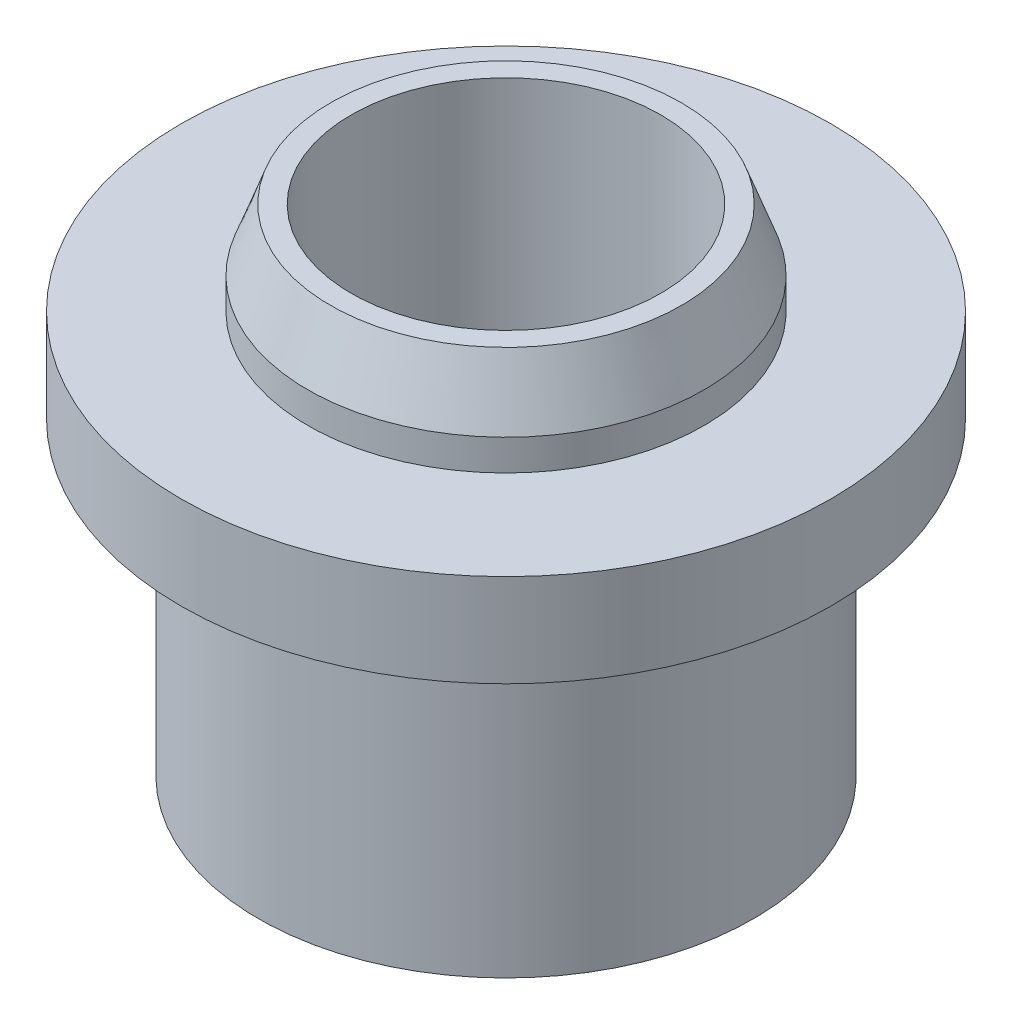
ISO-10303-21;
HEADER;
FILE_DESCRIPTION(('STEP AP214'),'2;1');
FILE_NAME('part.step','',(''),(''),'','','');
FILE_SCHEMA(('AUTOMOTIVE_DESIGN { 1 0 10303 214 1 1 1 1 }'));
ENDSEC;
DATA;
#1=APPLICATION_CONTEXT('core data for automotive mechanical design processes');
#2=APPLICATION_PROTOCOL_DEFINITION('international standard','automotive_design',2000,#1);
#3=PRODUCT_CONTEXT('',#1,'mechanical');
#4=PRODUCT('Part','Part','',(#3));
#5=PRODUCT_RELATED_PRODUCT_CATEGORY('part','',(#4));
#6=PRODUCT_DEFINITION_FORMATION('','',#4);
#7=PRODUCT_DEFINITION_CONTEXT('part definition',#1,'design');
#8=PRODUCT_DEFINITION('design','',#6,#7);
#9=PRODUCT_DEFINITION_SHAPE('','',#8);
#10=(LENGTH_UNIT() NAMED_UNIT(*) SI_UNIT(.MILLI.,.METRE.));
#11=(NAMED_UNIT(*) PLANE_ANGLE_UNIT() SI_UNIT($,.RADIAN.));
#12=(NAMED_UNIT(*) SI_UNIT($,.STERADIAN.) SOLID_ANGLE_UNIT());
#13=UNCERTAINTY_MEASURE_WITH_UNIT(LENGTH_MEASURE(1.E-05),#10,'distance_accuracy_value','');
#14=(GEOMETRIC_REPRESENTATION_CONTEXT(3) GLOBAL_UNCERTAINTY_ASSIGNED_CONTEXT((#13)) GLOBAL_UNIT_ASSIGNED_CONTEXT((#10,
#11,#12)) REPRESENTATION_CONTEXT('',''));
#15=CARTESIAN_POINT('',(0.,0.,0.));
#16=DIRECTION('',(0.,0.,1.));
#17=DIRECTION('',(1.,0.,0.));
#18=AXIS2_PLACEMENT_3D('',#15,#16,#17);
#19=CARTESIAN_POINT('',(4.,-0.0762641792075451,0.));
#20=DIRECTION('',(0.,-1.,0.));
#21=DIRECTION('',(0.,0.,-1.));
#22=AXIS2_PLACEMENT_3D('',#19,#20,#21);
#23=PLANE('',#22);
#24=CARTESIAN_POINT('',(0.,-0.076264179207545,0.));
#25=DIRECTION('',(0.,-1.,0.));
#26=DIRECTION('',(0.,0.,-1.));
#27=AXIS2_PLACEMENT_3D('',#24,#25,#26);
#28=CIRCLE('',#27,4.);
#29=CARTESIAN_POINT('',(0.,-0.076264179207545,-4.));
#30=VERTEX_POINT('',#29);
#31=EDGE_CURVE('E64',#30,#30,#28,.T.);
#32=ORIENTED_EDGE('',*,*,#31,.T.);
#33=EDGE_LOOP('',(#32));
#34=FACE_BOUND('',#33,.T.);
#35=CARTESIAN_POINT('',(0.,-0.0762641792075452,0.));
#36=DIRECTION('',(0.,-1.,0.));
#37=DIRECTION('',(0.,0.,-1.));
#38=AXIS2_PLACEMENT_3D('',#35,#36,#37);
#39=CIRCLE('',#38,2.5);
#40=CARTESIAN_POINT('',(0.,-0.0762641792075452,-2.5));
#41=VERTEX_POINT('',#40);
#42=EDGE_CURVE('E10',#41,#41,#39,.T.);
#43=ORIENTED_EDGE('',*,*,#42,.F.);
#44=EDGE_LOOP('',(#43));
#45=FACE_BOUND('',#44,.T.);
#46=ADVANCED_FACE('F33',(#34,#45),#23,.T.);
#47=CARTESIAN_POINT('',(0.,0.,0.));
#48=DIRECTION('',(0.,-1.,0.));
#49=DIRECTION('',(0.,0.,-1.));
#50=AXIS2_PLACEMENT_3D('',#47,#48,#49);
#51=CYLINDRICAL_SURFACE('',#50,2.5);
#52=ORIENTED_EDGE('',*,*,#42,.T.);
#53=EDGE_LOOP('',(#52));
#54=FACE_BOUND('',#53,.T.);
#55=CARTESIAN_POINT('',(0.,7.92373582079246,0.));
#56=DIRECTION('',(0.,-1.,0.));
#57=DIRECTION('',(0.,0.,-1.));
#58=AXIS2_PLACEMENT_3D('',#55,#56,#57);
#59=CIRCLE('',#58,2.5);
#60=CARTESIAN_POINT('',(0.,7.92373582079246,-2.5));
#61=VERTEX_POINT('',#60);
#62=EDGE_CURVE('E39',#61,#61,#59,.T.);
#63=ORIENTED_EDGE('',*,*,#62,.F.);
#64=EDGE_LOOP('',(#63));
#65=FACE_BOUND('',#64,.T.);
#66=ADVANCED_FACE('F82',(#54,#65),#51,.F.);
#67=CARTESIAN_POINT('',(2.5,7.92373582079246,0.));
#68=DIRECTION('',(0.,1.,0.));
#69=DIRECTION('',(0.,0.,1.));
#70=AXIS2_PLACEMENT_3D('',#67,#68,#69);
#71=PLANE('',#70);
#72=ORIENTED_EDGE('',*,*,#62,.T.);
#73=EDGE_LOOP('',(#72));
#74=FACE_BOUND('',#73,.T.);
#75=CARTESIAN_POINT('',(0.,7.92373582079246,0.));
#76=DIRECTION('',(0.,-1.,0.));
#77=DIRECTION('',(0.,0.,-1.));
#78=AXIS2_PLACEMENT_3D('',#75,#76,#77);
#79=CIRCLE('',#78,2.8360297657338);
#80=CARTESIAN_POINT('',(0.,7.92373582079246,-2.8360297657338));
#81=VERTEX_POINT('',#80);
#82=EDGE_CURVE('E43',#81,#81,#79,.T.);
#83=ORIENTED_EDGE('',*,*,#82,.F.);
#84=EDGE_LOOP('',(#83));
#85=FACE_BOUND('',#84,.T.);
#86=ADVANCED_FACE('F86',(#74,#85),#71,.T.);
#87=CARTESIAN_POINT('',(0.,6.92373582079246,0.));
#88=DIRECTION('',(0.,-1.,0.));
#89=DIRECTION('',(0.,0.,-1.));
#90=AXIS2_PLACEMENT_3D('',#87,#88,#89);
#91=CONICAL_SURFACE('',#90,3.2,0.349065850398863);
#92=ORIENTED_EDGE('',*,*,#82,.T.);
#93=EDGE_LOOP('',(#92));
#94=FACE_BOUND('',#93,.T.);
#95=CARTESIAN_POINT('',(0.,6.92373582079246,0.));
#96=DIRECTION('',(0.,-1.,0.));
#97=DIRECTION('',(0.,0.,-1.));
#98=AXIS2_PLACEMENT_3D('',#95,#96,#97);
#99=CIRCLE('',#98,3.2);
#100=CARTESIAN_POINT('',(0.,6.92373582079246,-3.2));
#101=VERTEX_POINT('',#100);
#102=EDGE_CURVE('E47',#101,#101,#99,.T.);
#103=ORIENTED_EDGE('',*,*,#102,.F.);
#104=EDGE_LOOP('',(#103));
#105=FACE_BOUND('',#104,.T.);
#106=ADVANCED_FACE('F90',(#94,#105),#91,.T.);
#107=CARTESIAN_POINT('',(0.,0.,0.));
#108=DIRECTION('',(0.,-1.,0.));
#109=DIRECTION('',(0.,0.,-1.));
#110=AXIS2_PLACEMENT_3D('',#107,#108,#109);
#111=CYLINDRICAL_SURFACE('',#110,3.2);
#112=ORIENTED_EDGE('',*,*,#102,.T.);
#113=EDGE_LOOP('',(#112));
#114=FACE_BOUND('',#113,.T.);
#115=CARTESIAN_POINT('',(0.,6.42373582079246,0.));
#116=DIRECTION('',(0.,-1.,0.));
#117=DIRECTION('',(0.,0.,-1.));
#118=AXIS2_PLACEMENT_3D('',#115,#116,#117);
#119=CIRCLE('',#118,3.2);
#120=CARTESIAN_POINT('',(0.,6.42373582079246,-3.2));
#121=VERTEX_POINT('',#120);
#122=EDGE_CURVE('E52',#121,#121,#119,.T.);
#123=ORIENTED_EDGE('',*,*,#122,.F.);
#124=EDGE_LOOP('',(#123));
#125=FACE_BOUND('',#124,.T.);
#126=ADVANCED_FACE('F96',(#114,#125),#111,.T.);
#127=CARTESIAN_POINT('',(3.2,6.42373582079246,0.));
#128=DIRECTION('',(0.,1.,0.));
#129=DIRECTION('',(0.,0.,1.));
#130=AXIS2_PLACEMENT_3D('',#127,#128,#129);
#131=PLANE('',#130);
#132=ORIENTED_EDGE('',*,*,#122,.T.);
#133=EDGE_LOOP('',(#132));
#134=FACE_BOUND('',#133,.T.);
#135=CARTESIAN_POINT('',(0.,6.42373582079246,0.));
#136=DIRECTION('',(0.,-1.,0.));
#137=DIRECTION('',(0.,0.,-1.));
#138=AXIS2_PLACEMENT_3D('',#135,#136,#137);
#139=CIRCLE('',#138,5.25);
#140=CARTESIAN_POINT('',(0.,6.42373582079246,-5.25));
#141=VERTEX_POINT('',#140);
#142=EDGE_CURVE('E55',#141,#141,#139,.T.);
#143=ORIENTED_EDGE('',*,*,#142,.F.);
#144=EDGE_LOOP('',(#143));
#145=FACE_BOUND('',#144,.T.);
#146=ADVANCED_FACE('F100',(#134,#145),#131,.T.);
#147=CARTESIAN_POINT('',(0.,0.,0.));
#148=DIRECTION('',(0.,-1.,0.));
#149=DIRECTION('',(0.,0.,-1.));
#150=AXIS2_PLACEMENT_3D('',#147,#148,#149);
#151=CYLINDRICAL_SURFACE('',#150,5.25);
#152=ORIENTED_EDGE('',*,*,#142,.T.);
#153=EDGE_LOOP('',(#152));
#154=FACE_BOUND('',#153,.T.);
#155=CARTESIAN_POINT('',(0.,4.92373582079246,0.));
#156=DIRECTION('',(0.,-1.,0.));
#157=DIRECTION('',(0.,0.,-1.));
#158=AXIS2_PLACEMENT_3D('',#155,#156,#157);
#159=CIRCLE('',#158,5.25);
#160=CARTESIAN_POINT('',(0.,4.92373582079246,-5.25));
#161=VERTEX_POINT('',#160);
#162=EDGE_CURVE('E58',#161,#161,#159,.T.);
#163=ORIENTED_EDGE('',*,*,#162,.F.);
#164=EDGE_LOOP('',(#163));
#165=FACE_BOUND('',#164,.T.);
#166=ADVANCED_FACE('F78',(#154,#165),#151,.T.);
#167=CARTESIAN_POINT('',(5.25,4.92373582079246,0.));
#168=DIRECTION('',(0.,-1.,0.));
#169=DIRECTION('',(0.,0.,-1.));
#170=AXIS2_PLACEMENT_3D('',#167,#168,#169);
#171=PLANE('',#170);
#172=ORIENTED_EDGE('',*,*,#162,.T.);
#173=EDGE_LOOP('',(#172));
#174=FACE_BOUND('',#173,.T.);
#175=CARTESIAN_POINT('',(0.,4.92373582079246,0.));
#176=DIRECTION('',(0.,-1.,0.));
#177=DIRECTION('',(0.,0.,-1.));
#178=AXIS2_PLACEMENT_3D('',#175,#176,#177);
#179=CIRCLE('',#178,4.);
#180=CARTESIAN_POINT('',(0.,4.92373582079246,-4.));
#181=VERTEX_POINT('',#180);
#182=EDGE_CURVE('E61',#181,#181,#179,.T.);
#183=ORIENTED_EDGE('',*,*,#182,.F.);
#184=EDGE_LOOP('',(#183));
#185=FACE_BOUND('',#184,.T.);
#186=ADVANCED_FACE('F72',(#174,#185),#171,.T.);
#187=CARTESIAN_POINT('',(0.,0.,0.));
#188=DIRECTION('',(0.,-1.,0.));
#189=DIRECTION('',(0.,0.,-1.));
#190=AXIS2_PLACEMENT_3D('',#187,#188,#189);
#191=CYLINDRICAL_SURFACE('',#190,4.);
#192=ORIENTED_EDGE('',*,*,#182,.T.);
#193=EDGE_LOOP('',(#192));
#194=FACE_BOUND('',#193,.T.);
#195=ORIENTED_EDGE('',*,*,#31,.F.);
#196=EDGE_LOOP('',(#195));
#197=FACE_BOUND('',#196,.T.);
#198=ADVANCED_FACE('F70',(#194,#197),#191,.T.);
#199=CLOSED_SHELL('',(#46,#66,#86,#106,#126,#146,#166,#186,#198));
#200=MANIFOLD_SOLID_BREP('B2',#199);
#201=ADVANCED_BREP_SHAPE_REPRESENTATION('',(#18,#200),#14);
#202=SHAPE_DEFINITION_REPRESENTATION(#9,#201);
ENDSEC;
END-ISO-10303-21;
